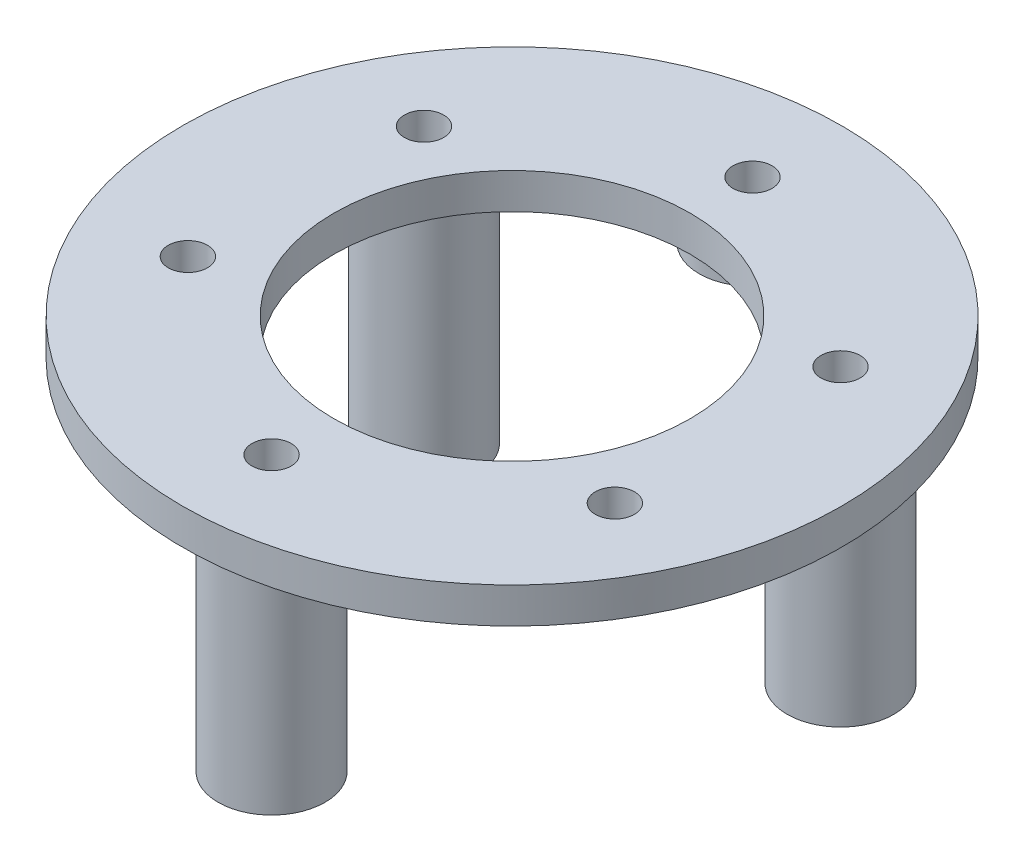
ISO-10303-21;
HEADER;
FILE_DESCRIPTION(('STEP AP214'),'2;1');
FILE_NAME('part.step','',(''),(''),'','','');
FILE_SCHEMA(('AUTOMOTIVE_DESIGN { 1 0 10303 214 1 1 1 1 }'));
ENDSEC;
DATA;
#1=APPLICATION_CONTEXT('core data for automotive mechanical design processes');
#2=APPLICATION_PROTOCOL_DEFINITION('international standard','automotive_design',2000,#1);
#3=PRODUCT_CONTEXT('',#1,'mechanical');
#4=PRODUCT('Part','Part','',(#3));
#5=PRODUCT_RELATED_PRODUCT_CATEGORY('part','',(#4));
#6=PRODUCT_DEFINITION_FORMATION('','',#4);
#7=PRODUCT_DEFINITION_CONTEXT('part definition',#1,'design');
#8=PRODUCT_DEFINITION('design','',#6,#7);
#9=PRODUCT_DEFINITION_SHAPE('','',#8);
#10=(LENGTH_UNIT() NAMED_UNIT(*) SI_UNIT(.MILLI.,.METRE.));
#11=(NAMED_UNIT(*) PLANE_ANGLE_UNIT() SI_UNIT($,.RADIAN.));
#12=(NAMED_UNIT(*) SI_UNIT($,.STERADIAN.) SOLID_ANGLE_UNIT());
#13=UNCERTAINTY_MEASURE_WITH_UNIT(LENGTH_MEASURE(1.E-05),#10,'distance_accuracy_value','');
#14=(GEOMETRIC_REPRESENTATION_CONTEXT(3) GLOBAL_UNCERTAINTY_ASSIGNED_CONTEXT((#13)) GLOBAL_UNIT_ASSIGNED_CONTEXT((#10,
#11,#12)) REPRESENTATION_CONTEXT('',''));
#15=CARTESIAN_POINT('',(0.,0.,0.));
#16=DIRECTION('',(0.,0.,1.));
#17=DIRECTION('',(1.,0.,0.));
#18=AXIS2_PLACEMENT_3D('',#15,#16,#17);
#19=CARTESIAN_POINT('',(0.,0.,0.));
#20=DIRECTION('',(0.,1.,0.));
#21=DIRECTION('',(0.,0.,1.));
#22=AXIS2_PLACEMENT_3D('',#19,#20,#21);
#23=PLANE('',#22);
#24=CARTESIAN_POINT('',(0.,0.,13.5));
#25=DIRECTION('',(0.,1.,0.));
#26=DIRECTION('',(0.,0.,1.));
#27=AXIS2_PLACEMENT_3D('',#24,#25,#26);
#28=CIRCLE('',#27,3.);
#29=CARTESIAN_POINT('',(0.,0.,16.5));
#30=VERTEX_POINT('',#29);
#31=EDGE_CURVE('E177',#30,#30,#28,.F.);
#32=ORIENTED_EDGE('',*,*,#31,.F.);
#33=EDGE_LOOP('',(#32));
#34=FACE_BOUND('',#33,.T.);
#35=CARTESIAN_POINT('',(0.,0.,0.));
#36=DIRECTION('',(0.,1.,0.));
#37=DIRECTION('',(0.,0.,1.));
#38=AXIS2_PLACEMENT_3D('',#35,#36,#37);
#39=CIRCLE('',#38,10.);
#40=CARTESIAN_POINT('',(0.,0.,10.));
#41=VERTEX_POINT('',#40);
#42=EDGE_CURVE('E162',#41,#41,#39,.T.);
#43=ORIENTED_EDGE('',*,*,#42,.T.);
#44=EDGE_LOOP('',(#43));
#45=FACE_BOUND('',#44,.T.);
#46=DIRECTION('',(-0.866025403784438,0.,0.5));
#47=VECTOR('',#46,1.);
#48=CARTESIAN_POINT('',(-6.38397459621556,0.,-13.0573683548744));
#49=LINE('',#48,#47);
#50=CARTESIAN_POINT('',(-6.38397459621556,0.,-13.0573683548744));
#51=VERTEX_POINT('',#50);
#52=CARTESIAN_POINT('',(-8.11602540378444,0.,-12.0573683548744));
#53=VERTEX_POINT('',#52);
#54=EDGE_CURVE('E79',#51,#53,#49,.T.);
#55=ORIENTED_EDGE('',*,*,#54,.F.);
#56=DIRECTION('',(0.5,0.,0.866025403784439));
#57=VECTOR('',#56,1.);
#58=CARTESIAN_POINT('',(-8.38397459621556,0.,-16.5214699700121));
#59=LINE('',#58,#57);
#60=CARTESIAN_POINT('',(-8.37045119717114,0.,-16.4980467557762));
#61=VERTEX_POINT('',#60);
#62=EDGE_CURVE('E90',#61,#51,#59,.T.);
#63=ORIENTED_EDGE('',*,*,#62,.F.);
#64=CARTESIAN_POINT('',(0.,0.,0.));
#65=DIRECTION('',(0.,1.,0.));
#66=DIRECTION('',(0.,0.,1.));
#67=AXIS2_PLACEMENT_3D('',#64,#65,#66);
#68=CIRCLE('',#67,18.5);
#69=CARTESIAN_POINT('',(-10.10250200474,0.,-15.4980467557762));
#70=VERTEX_POINT('',#69);
#71=EDGE_CURVE('E166',#70,#61,#68,.T.);
#72=ORIENTED_EDGE('',*,*,#71,.F.);
#73=DIRECTION('',(-0.5,0.,-0.866025403784438));
#74=VECTOR('',#73,1.);
#75=CARTESIAN_POINT('',(-10.1160254037844,0.,-15.5214699700121));
#76=LINE('',#75,#74);
#77=EDGE_CURVE('E92',#53,#70,#76,.T.);
#78=ORIENTED_EDGE('',*,*,#77,.F.);
#79=EDGE_LOOP('',(#55,#63,#72,#78));
#80=FACE_BOUND('',#79,.T.);
#81=CARTESIAN_POINT('',(0.,0.,-13.5));
#82=DIRECTION('',(0.,1.,0.));
#83=DIRECTION('',(0.,0.,1.));
#84=AXIS2_PLACEMENT_3D('',#81,#82,#83);
#85=CIRCLE('',#84,3.);
#86=CARTESIAN_POINT('',(0.,0.,-10.5));
#87=VERTEX_POINT('',#86);
#88=EDGE_CURVE('E147',#87,#87,#85,.T.);
#89=ORIENTED_EDGE('',*,*,#88,.T.);
#90=EDGE_LOOP('',(#89));
#91=FACE_BOUND('',#90,.T.);
#92=CARTESIAN_POINT('',(-11.9855076993414,0.,6.21269709458206));
#93=DIRECTION('',(0.,1.,0.));
#94=DIRECTION('',(0.,0.,1.));
#95=AXIS2_PLACEMENT_3D('',#92,#93,#94);
#96=CIRCLE('',#95,3.);
#97=CARTESIAN_POINT('',(-11.9855076993414,0.,9.21269709458206));
#98=VERTEX_POINT('',#97);
#99=EDGE_CURVE('E138',#98,#98,#96,.T.);
#100=ORIENTED_EDGE('',*,*,#99,.T.);
#101=EDGE_LOOP('',(#100));
#102=FACE_BOUND('',#101,.T.);
#103=CARTESIAN_POINT('',(11.9855076993414,0.,6.21269709458206));
#104=DIRECTION('',(0.,1.,0.));
#105=DIRECTION('',(0.,0.,1.));
#106=AXIS2_PLACEMENT_3D('',#103,#104,#105);
#107=CIRCLE('',#106,3.);
#108=CARTESIAN_POINT('',(11.9855076993414,0.,9.21269709458206));
#109=VERTEX_POINT('',#108);
#110=EDGE_CURVE('E129',#109,#109,#107,.T.);
#111=ORIENTED_EDGE('',*,*,#110,.T.);
#112=EDGE_LOOP('',(#111));
#113=FACE_BOUND('',#112,.T.);
#114=CARTESIAN_POINT('',(-11.6913429510899,0.,-6.75000000000005));
#115=DIRECTION('',(0.,1.,0.));
#116=DIRECTION('',(0.,0.,1.));
#117=AXIS2_PLACEMENT_3D('',#114,#115,#116);
#118=CIRCLE('',#117,3.);
#119=CARTESIAN_POINT('',(-11.6913429510899,0.,-3.75000000000005));
#120=VERTEX_POINT('',#119);
#121=EDGE_CURVE('E172',#120,#120,#118,.F.);
#122=ORIENTED_EDGE('',*,*,#121,.F.);
#123=EDGE_LOOP('',(#122));
#124=FACE_BOUND('',#123,.T.);
#125=CARTESIAN_POINT('',(11.6913429510899,0.,-6.75000000000006));
#126=DIRECTION('',(0.,1.,0.));
#127=DIRECTION('',(0.,0.,1.));
#128=AXIS2_PLACEMENT_3D('',#125,#126,#127);
#129=CIRCLE('',#128,3.);
#130=CARTESIAN_POINT('',(11.6913429510899,0.,-3.75000000000006));
#131=VERTEX_POINT('',#130);
#132=EDGE_CURVE('E180',#131,#131,#129,.F.);
#133=ORIENTED_EDGE('',*,*,#132,.F.);
#134=EDGE_LOOP('',(#133));
#135=FACE_BOUND('',#134,.T.);
#136=ADVANCED_FACE('F33',(#34,#45,#80,#91,#102,#113,#124,#135),#23,.F.);
#137=CARTESIAN_POINT('',(0.,2.,0.));
#138=DIRECTION('',(0.,1.,0.));
#139=DIRECTION('',(0.,0.,1.));
#140=AXIS2_PLACEMENT_3D('',#137,#138,#139);
#141=PLANE('',#140);
#142=CARTESIAN_POINT('',(-11.6913429510899,2.,-6.75000000000005));
#143=DIRECTION('',(0.,1.,0.));
#144=DIRECTION('',(0.,0.,1.));
#145=AXIS2_PLACEMENT_3D('',#142,#143,#144);
#146=CIRCLE('',#145,1.10000000000001);
#147=CARTESIAN_POINT('',(-11.6913429510899,2.,-5.65000000000004));
#148=VERTEX_POINT('',#147);
#149=EDGE_CURVE('E118',#148,#148,#146,.T.);
#150=ORIENTED_EDGE('',*,*,#149,.F.);
#151=EDGE_LOOP('',(#150));
#152=FACE_BOUND('',#151,.T.);
#153=CARTESIAN_POINT('',(11.6913429510899,2.,-6.75000000000006));
#154=DIRECTION('',(0.,1.,0.));
#155=DIRECTION('',(0.,0.,1.));
#156=AXIS2_PLACEMENT_3D('',#153,#154,#155);
#157=CIRCLE('',#156,1.1);
#158=CARTESIAN_POINT('',(11.6913429510899,2.,-5.65000000000006));
#159=VERTEX_POINT('',#158);
#160=EDGE_CURVE('E122',#159,#159,#157,.T.);
#161=ORIENTED_EDGE('',*,*,#160,.F.);
#162=EDGE_LOOP('',(#161));
#163=FACE_BOUND('',#162,.T.);
#164=CARTESIAN_POINT('',(0.,2.,13.5));
#165=DIRECTION('',(0.,1.,0.));
#166=DIRECTION('',(0.,0.,1.));
#167=AXIS2_PLACEMENT_3D('',#164,#165,#166);
#168=CIRCLE('',#167,1.1);
#169=CARTESIAN_POINT('',(0.,2.,14.6));
#170=VERTEX_POINT('',#169);
#171=EDGE_CURVE('E117',#170,#170,#168,.T.);
#172=ORIENTED_EDGE('',*,*,#171,.F.);
#173=EDGE_LOOP('',(#172));
#174=FACE_BOUND('',#173,.T.);
#175=CARTESIAN_POINT('',(11.9855076993414,2.,6.21269709458206));
#176=DIRECTION('',(0.,1.,0.));
#177=DIRECTION('',(0.,0.,1.));
#178=AXIS2_PLACEMENT_3D('',#175,#176,#177);
#179=CIRCLE('',#178,1.1);
#180=CARTESIAN_POINT('',(11.9855076993414,2.,7.31269709458206));
#181=VERTEX_POINT('',#180);
#182=EDGE_CURVE('E156',#181,#181,#179,.T.);
#183=ORIENTED_EDGE('',*,*,#182,.F.);
#184=EDGE_LOOP('',(#183));
#185=FACE_BOUND('',#184,.T.);
#186=CARTESIAN_POINT('',(0.,2.,0.));
#187=DIRECTION('',(0.,1.,0.));
#188=DIRECTION('',(0.,0.,1.));
#189=AXIS2_PLACEMENT_3D('',#186,#187,#188);
#190=CIRCLE('',#189,10.);
#191=CARTESIAN_POINT('',(0.,2.,10.));
#192=VERTEX_POINT('',#191);
#193=EDGE_CURVE('E163',#192,#192,#190,.T.);
#194=ORIENTED_EDGE('',*,*,#193,.F.);
#195=EDGE_LOOP('',(#194));
#196=FACE_BOUND('',#195,.T.);
#197=CARTESIAN_POINT('',(0.,2.,0.));
#198=DIRECTION('',(0.,1.,0.));
#199=DIRECTION('',(0.,0.,1.));
#200=AXIS2_PLACEMENT_3D('',#197,#198,#199);
#201=CIRCLE('',#200,18.5);
#202=CARTESIAN_POINT('',(0.,2.,18.5));
#203=VERTEX_POINT('',#202);
#204=EDGE_CURVE('E169',#203,#203,#201,.T.);
#205=ORIENTED_EDGE('',*,*,#204,.T.);
#206=EDGE_LOOP('',(#205));
#207=FACE_BOUND('',#206,.T.);
#208=CARTESIAN_POINT('',(0.,2.,-13.5));
#209=DIRECTION('',(0.,1.,0.));
#210=DIRECTION('',(0.,0.,1.));
#211=AXIS2_PLACEMENT_3D('',#208,#209,#210);
#212=CIRCLE('',#211,1.1);
#213=CARTESIAN_POINT('',(0.,2.,-12.4));
#214=VERTEX_POINT('',#213);
#215=EDGE_CURVE('E159',#214,#214,#212,.T.);
#216=ORIENTED_EDGE('',*,*,#215,.F.);
#217=EDGE_LOOP('',(#216));
#218=FACE_BOUND('',#217,.T.);
#219=CARTESIAN_POINT('',(-11.9855076993414,2.,6.21269709458206));
#220=DIRECTION('',(0.,1.,0.));
#221=DIRECTION('',(0.,0.,1.));
#222=AXIS2_PLACEMENT_3D('',#219,#220,#221);
#223=CIRCLE('',#222,1.1);
#224=CARTESIAN_POINT('',(-11.9855076993414,2.,7.31269709458206));
#225=VERTEX_POINT('',#224);
#226=EDGE_CURVE('E151',#225,#225,#223,.T.);
#227=ORIENTED_EDGE('',*,*,#226,.F.);
#228=EDGE_LOOP('',(#227));
#229=FACE_BOUND('',#228,.T.);
#230=ADVANCED_FACE('F204',(#152,#163,#174,#185,#196,#207,#218,#229),#141,.T.);
#231=CARTESIAN_POINT('',(0.,2.,0.));
#232=DIRECTION('',(0.,-1.,0.));
#233=DIRECTION('',(0.,0.,-1.));
#234=AXIS2_PLACEMENT_3D('',#231,#232,#233);
#235=CYLINDRICAL_SURFACE('',#234,18.5);
#236=ORIENTED_EDGE('',*,*,#71,.T.);
#237=DIRECTION('',(0.,-1.,0.));
#238=VECTOR('',#237,1.);
#239=CARTESIAN_POINT('',(-8.37045119717114,2.,-16.4980467557762));
#240=LINE('',#239,#238);
#241=CARTESIAN_POINT('',(-8.37045119717114,0.44,-16.4980467557762));
#242=VERTEX_POINT('',#241);
#243=EDGE_CURVE('E11',#61,#242,#240,.F.);
#244=ORIENTED_EDGE('',*,*,#243,.T.);
#245=CARTESIAN_POINT('',(0.,0.44,0.));
#246=DIRECTION('',(0.,1.,0.));
#247=DIRECTION('',(0.,0.,1.));
#248=AXIS2_PLACEMENT_3D('',#245,#246,#247);
#249=CIRCLE('',#248,18.5);
#250=CARTESIAN_POINT('',(-10.10250200474,0.44,-15.4980467557762));
#251=VERTEX_POINT('',#250);
#252=EDGE_CURVE('E53',#242,#251,#249,.T.);
#253=ORIENTED_EDGE('',*,*,#252,.T.);
#254=DIRECTION('',(0.,-1.,0.));
#255=VECTOR('',#254,1.);
#256=CARTESIAN_POINT('',(-10.10250200474,2.,-15.4980467557762));
#257=LINE('',#256,#255);
#258=EDGE_CURVE('E41',#251,#70,#257,.T.);
#259=ORIENTED_EDGE('',*,*,#258,.T.);
#260=EDGE_LOOP('',(#236,#244,#253,#259));
#261=FACE_BOUND('',#260,.T.);
#262=ORIENTED_EDGE('',*,*,#204,.F.);
#263=EDGE_LOOP('',(#262));
#264=FACE_BOUND('',#263,.T.);
#265=ADVANCED_FACE('F35',(#261,#264),#235,.T.);
#266=CARTESIAN_POINT('',(0.,2.,0.));
#267=DIRECTION('',(0.,-1.,0.));
#268=DIRECTION('',(0.,0.,-1.));
#269=AXIS2_PLACEMENT_3D('',#266,#267,#268);
#270=CYLINDRICAL_SURFACE('',#269,10.);
#271=ORIENTED_EDGE('',*,*,#193,.T.);
#272=EDGE_LOOP('',(#271));
#273=FACE_BOUND('',#272,.T.);
#274=ORIENTED_EDGE('',*,*,#42,.F.);
#275=EDGE_LOOP('',(#274));
#276=FACE_BOUND('',#275,.T.);
#277=ADVANCED_FACE('F214',(#273,#276),#270,.F.);
#278=CARTESIAN_POINT('',(0.,2.,-13.5));
#279=DIRECTION('',(0.,-1.,0.));
#280=DIRECTION('',(0.,0.,-1.));
#281=AXIS2_PLACEMENT_3D('',#278,#279,#280);
#282=CYLINDRICAL_SURFACE('',#281,1.1);
#283=ORIENTED_EDGE('',*,*,#215,.T.);
#284=EDGE_LOOP('',(#283));
#285=FACE_BOUND('',#284,.T.);
#286=CARTESIAN_POINT('',(0.,-1.2,-13.5));
#287=DIRECTION('',(0.,1.,0.));
#288=DIRECTION('',(0.,0.,1.));
#289=AXIS2_PLACEMENT_3D('',#286,#287,#288);
#290=CIRCLE('',#289,1.1);
#291=CARTESIAN_POINT('',(0.,-1.2,-12.4));
#292=VERTEX_POINT('',#291);
#293=EDGE_CURVE('E142',#292,#292,#290,.T.);
#294=ORIENTED_EDGE('',*,*,#293,.F.);
#295=EDGE_LOOP('',(#294));
#296=FACE_BOUND('',#295,.T.);
#297=ADVANCED_FACE('F217',(#285,#296),#282,.F.);
#298=CARTESIAN_POINT('',(11.9855076993414,2.,6.21269709458206));
#299=DIRECTION('',(0.,-1.,0.));
#300=DIRECTION('',(0.,0.,-1.));
#301=AXIS2_PLACEMENT_3D('',#298,#299,#300);
#302=CYLINDRICAL_SURFACE('',#301,1.1);
#303=ORIENTED_EDGE('',*,*,#182,.T.);
#304=EDGE_LOOP('',(#303));
#305=FACE_BOUND('',#304,.T.);
#306=CARTESIAN_POINT('',(11.9855076993414,-1.2,6.21269709458206));
#307=DIRECTION('',(0.,1.,0.));
#308=DIRECTION('',(0.,0.,1.));
#309=AXIS2_PLACEMENT_3D('',#306,#307,#308);
#310=CIRCLE('',#309,1.1);
#311=CARTESIAN_POINT('',(11.9855076993414,-1.2,7.31269709458206));
#312=VERTEX_POINT('',#311);
#313=EDGE_CURVE('E121',#312,#312,#310,.T.);
#314=ORIENTED_EDGE('',*,*,#313,.F.);
#315=EDGE_LOOP('',(#314));
#316=FACE_BOUND('',#315,.T.);
#317=ADVANCED_FACE('F221',(#305,#316),#302,.F.);
#318=CARTESIAN_POINT('',(-11.9855076993414,2.,6.21269709458206));
#319=DIRECTION('',(0.,-1.,0.));
#320=DIRECTION('',(0.,0.,-1.));
#321=AXIS2_PLACEMENT_3D('',#318,#319,#320);
#322=CYLINDRICAL_SURFACE('',#321,1.1);
#323=ORIENTED_EDGE('',*,*,#226,.T.);
#324=EDGE_LOOP('',(#323));
#325=FACE_BOUND('',#324,.T.);
#326=CARTESIAN_POINT('',(-11.9855076993414,-1.2,6.21269709458206));
#327=DIRECTION('',(0.,1.,0.));
#328=DIRECTION('',(0.,0.,1.));
#329=AXIS2_PLACEMENT_3D('',#326,#327,#328);
#330=CIRCLE('',#329,1.1);
#331=CARTESIAN_POINT('',(-11.9855076993414,-1.2,7.31269709458206));
#332=VERTEX_POINT('',#331);
#333=EDGE_CURVE('E133',#332,#332,#330,.T.);
#334=ORIENTED_EDGE('',*,*,#333,.F.);
#335=EDGE_LOOP('',(#334));
#336=FACE_BOUND('',#335,.T.);
#337=ADVANCED_FACE('F225',(#325,#336),#322,.F.);
#338=CARTESIAN_POINT('',(0.,-1.2,-13.5));
#339=DIRECTION('',(0.,1.,0.));
#340=DIRECTION('',(0.,0.,1.));
#341=AXIS2_PLACEMENT_3D('',#338,#339,#340);
#342=CYLINDRICAL_SURFACE('',#341,3.);
#343=CARTESIAN_POINT('',(0.,-1.2,-13.5));
#344=DIRECTION('',(0.,1.,0.));
#345=DIRECTION('',(0.,0.,1.));
#346=AXIS2_PLACEMENT_3D('',#343,#344,#345);
#347=CIRCLE('',#346,3.);
#348=CARTESIAN_POINT('',(0.,-1.2,-10.5));
#349=VERTEX_POINT('',#348);
#350=EDGE_CURVE('E148',#349,#349,#347,.T.);
#351=ORIENTED_EDGE('',*,*,#350,.T.);
#352=EDGE_LOOP('',(#351));
#353=FACE_BOUND('',#352,.T.);
#354=ORIENTED_EDGE('',*,*,#88,.F.);
#355=EDGE_LOOP('',(#354));
#356=FACE_BOUND('',#355,.T.);
#357=ADVANCED_FACE('F229',(#353,#356),#342,.T.);
#358=CARTESIAN_POINT('',(0.,-1.2,-13.5));
#359=DIRECTION('',(0.,1.,0.));
#360=DIRECTION('',(0.,0.,1.));
#361=AXIS2_PLACEMENT_3D('',#358,#359,#360);
#362=PLANE('',#361);
#363=ORIENTED_EDGE('',*,*,#293,.T.);
#364=EDGE_LOOP('',(#363));
#365=FACE_BOUND('',#364,.T.);
#366=ORIENTED_EDGE('',*,*,#350,.F.);
#367=EDGE_LOOP('',(#366));
#368=FACE_BOUND('',#367,.T.);
#369=ADVANCED_FACE('F233',(#365,#368),#362,.F.);
#370=CARTESIAN_POINT('',(-11.9855076993414,-1.2,6.21269709458206));
#371=DIRECTION('',(0.,1.,0.));
#372=DIRECTION('',(0.,0.,1.));
#373=AXIS2_PLACEMENT_3D('',#370,#371,#372);
#374=CYLINDRICAL_SURFACE('',#373,3.);
#375=CARTESIAN_POINT('',(-11.9855076993414,-1.2,6.21269709458206));
#376=DIRECTION('',(0.,1.,0.));
#377=DIRECTION('',(0.,0.,1.));
#378=AXIS2_PLACEMENT_3D('',#375,#376,#377);
#379=CIRCLE('',#378,3.);
#380=CARTESIAN_POINT('',(-11.9855076993414,-1.2,9.21269709458206));
#381=VERTEX_POINT('',#380);
#382=EDGE_CURVE('E139',#381,#381,#379,.T.);
#383=ORIENTED_EDGE('',*,*,#382,.T.);
#384=EDGE_LOOP('',(#383));
#385=FACE_BOUND('',#384,.T.);
#386=ORIENTED_EDGE('',*,*,#99,.F.);
#387=EDGE_LOOP('',(#386));
#388=FACE_BOUND('',#387,.T.);
#389=ADVANCED_FACE('F237',(#385,#388),#374,.T.);
#390=CARTESIAN_POINT('',(-11.9855076993414,-1.2,6.21269709458206));
#391=DIRECTION('',(0.,1.,0.));
#392=DIRECTION('',(0.,0.,1.));
#393=AXIS2_PLACEMENT_3D('',#390,#391,#392);
#394=PLANE('',#393);
#395=ORIENTED_EDGE('',*,*,#333,.T.);
#396=EDGE_LOOP('',(#395));
#397=FACE_BOUND('',#396,.T.);
#398=ORIENTED_EDGE('',*,*,#382,.F.);
#399=EDGE_LOOP('',(#398));
#400=FACE_BOUND('',#399,.T.);
#401=ADVANCED_FACE('F241',(#397,#400),#394,.F.);
#402=CARTESIAN_POINT('',(11.9855076993414,-1.2,6.21269709458206));
#403=DIRECTION('',(0.,1.,0.));
#404=DIRECTION('',(0.,0.,1.));
#405=AXIS2_PLACEMENT_3D('',#402,#403,#404);
#406=CYLINDRICAL_SURFACE('',#405,3.);
#407=CARTESIAN_POINT('',(11.9855076993414,-1.2,6.21269709458206));
#408=DIRECTION('',(0.,1.,0.));
#409=DIRECTION('',(0.,0.,1.));
#410=AXIS2_PLACEMENT_3D('',#407,#408,#409);
#411=CIRCLE('',#410,3.);
#412=CARTESIAN_POINT('',(11.9855076993414,-1.2,9.21269709458206));
#413=VERTEX_POINT('',#412);
#414=EDGE_CURVE('E130',#413,#413,#411,.T.);
#415=ORIENTED_EDGE('',*,*,#414,.T.);
#416=EDGE_LOOP('',(#415));
#417=FACE_BOUND('',#416,.T.);
#418=ORIENTED_EDGE('',*,*,#110,.F.);
#419=EDGE_LOOP('',(#418));
#420=FACE_BOUND('',#419,.T.);
#421=ADVANCED_FACE('F245',(#417,#420),#406,.T.);
#422=CARTESIAN_POINT('',(11.9855076993414,-1.2,6.21269709458206));
#423=DIRECTION('',(0.,1.,0.));
#424=DIRECTION('',(0.,0.,1.));
#425=AXIS2_PLACEMENT_3D('',#422,#423,#424);
#426=PLANE('',#425);
#427=ORIENTED_EDGE('',*,*,#313,.T.);
#428=EDGE_LOOP('',(#427));
#429=FACE_BOUND('',#428,.T.);
#430=ORIENTED_EDGE('',*,*,#414,.F.);
#431=EDGE_LOOP('',(#430));
#432=FACE_BOUND('',#431,.T.);
#433=ADVANCED_FACE('F249',(#429,#432),#426,.F.);
#434=CARTESIAN_POINT('',(0.,-1.2,13.5));
#435=DIRECTION('',(0.,1.,0.));
#436=DIRECTION('',(0.,0.,1.));
#437=AXIS2_PLACEMENT_3D('',#434,#435,#436);
#438=CYLINDRICAL_SURFACE('',#437,1.1);
#439=CARTESIAN_POINT('',(0.,-13.4,13.5));
#440=DIRECTION('',(0.,-1.,0.));
#441=DIRECTION('',(0.,0.,-1.));
#442=AXIS2_PLACEMENT_3D('',#439,#440,#441);
#443=CIRCLE('',#442,1.1);
#444=CARTESIAN_POINT('',(0.,-13.4,14.6));
#445=VERTEX_POINT('',#444);
#446=EDGE_CURVE('E105',#445,#445,#443,.T.);
#447=CARTESIAN_POINT('',(0.,2.,14.6));
#448=CARTESIAN_POINT('',(0.,1.83958333333333,14.6));
#449=CARTESIAN_POINT('',(0.,1.67916666666667,14.6));
#450=CARTESIAN_POINT('',(0.,1.35833333333333,14.6));
#451=CARTESIAN_POINT('',(0.,1.19791666666667,14.6));
#452=CARTESIAN_POINT('',(0.,0.877083333333333,14.6));
#453=CARTESIAN_POINT('',(0.,0.716666666666666,14.6));
#454=CARTESIAN_POINT('',(0.,0.395833333333333,14.6));
#455=CARTESIAN_POINT('',(0.,0.235416666666666,14.6));
#456=CARTESIAN_POINT('',(0.,-0.0854166666666672,14.6));
#457=CARTESIAN_POINT('',(0.,-0.245833333333334,14.6));
#458=CARTESIAN_POINT('',(0.,-0.566666666666667,14.6));
#459=CARTESIAN_POINT('',(0.,-0.727083333333334,14.6));
#460=CARTESIAN_POINT('',(0.,-1.04791666666667,14.6));
#461=CARTESIAN_POINT('',(0.,-1.20833333333333,14.6));
#462=CARTESIAN_POINT('',(0.,-1.52916666666667,14.6));
#463=CARTESIAN_POINT('',(0.,-1.68958333333333,14.6));
#464=CARTESIAN_POINT('',(0.,-2.01041666666667,14.6));
#465=CARTESIAN_POINT('',(0.,-2.17083333333333,14.6));
#466=CARTESIAN_POINT('',(0.,-2.49166666666667,14.6));
#467=CARTESIAN_POINT('',(0.,-2.65208333333333,14.6));
#468=CARTESIAN_POINT('',(0.,-2.97291666666667,14.6));
#469=CARTESIAN_POINT('',(0.,-3.13333333333333,14.6));
#470=CARTESIAN_POINT('',(0.,-3.45416666666667,14.6));
#471=CARTESIAN_POINT('',(0.,-3.61458333333333,14.6));
#472=CARTESIAN_POINT('',(0.,-3.93541666666667,14.6));
#473=CARTESIAN_POINT('',(0.,-4.09583333333333,14.6));
#474=CARTESIAN_POINT('',(0.,-4.41666666666667,14.6));
#475=CARTESIAN_POINT('',(0.,-4.57708333333333,14.6));
#476=CARTESIAN_POINT('',(0.,-4.89791666666667,14.6));
#477=CARTESIAN_POINT('',(0.,-5.05833333333333,14.6));
#478=CARTESIAN_POINT('',(0.,-5.37916666666667,14.6));
#479=CARTESIAN_POINT('',(0.,-5.53958333333333,14.6));
#480=CARTESIAN_POINT('',(0.,-5.86041666666667,14.6));
#481=CARTESIAN_POINT('',(0.,-6.02083333333333,14.6));
#482=CARTESIAN_POINT('',(0.,-6.34166666666667,14.6));
#483=CARTESIAN_POINT('',(0.,-6.50208333333333,14.6));
#484=CARTESIAN_POINT('',(0.,-6.82291666666667,14.6));
#485=CARTESIAN_POINT('',(0.,-6.98333333333333,14.6));
#486=CARTESIAN_POINT('',(0.,-7.30416666666667,14.6));
#487=CARTESIAN_POINT('',(0.,-7.46458333333333,14.6));
#488=CARTESIAN_POINT('',(0.,-7.78541666666667,14.6));
#489=CARTESIAN_POINT('',(0.,-7.94583333333333,14.6));
#490=CARTESIAN_POINT('',(0.,-8.26666666666667,14.6));
#491=CARTESIAN_POINT('',(0.,-8.42708333333333,14.6));
#492=CARTESIAN_POINT('',(0.,-8.74791666666667,14.6));
#493=CARTESIAN_POINT('',(0.,-8.90833333333333,14.6));
#494=CARTESIAN_POINT('',(0.,-9.22916666666667,14.6));
#495=CARTESIAN_POINT('',(0.,-9.38958333333333,14.6));
#496=CARTESIAN_POINT('',(0.,-9.71041666666667,14.6));
#497=CARTESIAN_POINT('',(0.,-9.87083333333333,14.6));
#498=CARTESIAN_POINT('',(0.,-10.1916666666667,14.6));
#499=CARTESIAN_POINT('',(0.,-10.3520833333333,14.6));
#500=CARTESIAN_POINT('',(0.,-10.6729166666667,14.6));
#501=CARTESIAN_POINT('',(0.,-10.8333333333333,14.6));
#502=CARTESIAN_POINT('',(0.,-11.1541666666667,14.6));
#503=CARTESIAN_POINT('',(0.,-11.3145833333333,14.6));
#504=CARTESIAN_POINT('',(0.,-11.6354166666667,14.6));
#505=CARTESIAN_POINT('',(0.,-11.7958333333333,14.6));
#506=CARTESIAN_POINT('',(0.,-12.1166666666667,14.6));
#507=CARTESIAN_POINT('',(0.,-12.2770833333333,14.6));
#508=CARTESIAN_POINT('',(0.,-12.5979166666667,14.6));
#509=CARTESIAN_POINT('',(0.,-12.7583333333333,14.6));
#510=CARTESIAN_POINT('',(0.,-13.0791666666667,14.6));
#511=CARTESIAN_POINT('',(0.,-13.2395833333333,14.6));
#512=CARTESIAN_POINT('',(0.,-13.4,14.6));
#513=B_SPLINE_CURVE_WITH_KNOTS('',3,(#447,#448,#449,#450,#451,#452,#453,#454,#455,#456,#457,
#458,#459,#460,#461,#462,#463,#464,#465,#466,#467,#468,#469,#470,#471,#472,#473,#474,#475,#476,
#477,#478,#479,#480,#481,#482,#483,#484,#485,#486,#487,#488,#489,#490,#491,#492,#493,#494,#495,
#496,#497,#498,#499,#500,#501,#502,#503,#504,#505,#506,#507,#508,#509,#510,#511,#512),
.UNSPECIFIED.,.F.,.F.,(4,2,2,2,2,2,2,2,2,2,2,2,2,2,2,2,2,2,2,2,2,2,2,2,2,2,2,2,2,2,2,2,4),(0.,
0.48125,0.9625,1.44375,1.925,2.40625,2.8875,3.36875,3.85,4.33125,4.8125,5.29375,5.775,6.25625,
6.7375,7.21875,7.7,8.18125,8.6625,9.14375,9.625,10.10625,10.5875,11.06875,11.55,12.03125,
12.5125,12.99375,13.475,13.95625,14.4375,14.91875,15.4),.UNSPECIFIED.);
#514=EDGE_CURVE('BSEAM253',#170,#445,#513,.T.);
#515=ORIENTED_EDGE('',*,*,#171,.T.);
#516=ORIENTED_EDGE('',*,*,#446,.T.);
#517=ORIENTED_EDGE('',*,*,#514,.T.);
#518=ORIENTED_EDGE('',*,*,#514,.F.);
#519=EDGE_LOOP('',(#515,#517,#516,#518));
#520=FACE_BOUND('',#519,.T.);
#521=ADVANCED_FACE('F253',(#520),#438,.F.);
#522=CARTESIAN_POINT('',(11.6913429510899,-1.2,-6.75000000000006));
#523=DIRECTION('',(0.,1.,0.));
#524=DIRECTION('',(0.,0.,1.));
#525=AXIS2_PLACEMENT_3D('',#522,#523,#524);
#526=CYLINDRICAL_SURFACE('',#525,1.1);
#527=CARTESIAN_POINT('',(11.6913429510899,-13.4,-6.75000000000006));
#528=DIRECTION('',(0.,-1.,0.));
#529=DIRECTION('',(0.,0.,-1.));
#530=AXIS2_PLACEMENT_3D('',#527,#528,#529);
#531=CIRCLE('',#530,1.1);
#532=CARTESIAN_POINT('',(11.6913429510899,-13.4,-5.65000000000006));
#533=VERTEX_POINT('',#532);
#534=EDGE_CURVE('E98',#533,#533,#531,.T.);
#535=CARTESIAN_POINT('',(11.6913429510899,2.,-5.65000000000006));
#536=CARTESIAN_POINT('',(11.6913429510899,1.83958333333333,-5.65000000000006));
#537=CARTESIAN_POINT('',(11.6913429510899,1.67916666666667,-5.65000000000006));
#538=CARTESIAN_POINT('',(11.6913429510899,1.35833333333333,-5.65000000000006));
#539=CARTESIAN_POINT('',(11.6913429510899,1.19791666666667,-5.65000000000006));
#540=CARTESIAN_POINT('',(11.6913429510899,0.877083333333333,-5.65000000000006));
#541=CARTESIAN_POINT('',(11.6913429510899,0.716666666666666,-5.65000000000006));
#542=CARTESIAN_POINT('',(11.6913429510899,0.395833333333333,-5.65000000000006));
#543=CARTESIAN_POINT('',(11.6913429510899,0.235416666666666,-5.65000000000006));
#544=CARTESIAN_POINT('',(11.6913429510899,-0.0854166666666672,-5.65000000000006));
#545=CARTESIAN_POINT('',(11.6913429510899,-0.245833333333334,-5.65000000000006));
#546=CARTESIAN_POINT('',(11.6913429510899,-0.566666666666667,-5.65000000000006));
#547=CARTESIAN_POINT('',(11.6913429510899,-0.727083333333334,-5.65000000000006));
#548=CARTESIAN_POINT('',(11.6913429510899,-1.04791666666667,-5.65000000000006));
#549=CARTESIAN_POINT('',(11.6913429510899,-1.20833333333333,-5.65000000000006));
#550=CARTESIAN_POINT('',(11.6913429510899,-1.52916666666667,-5.65000000000006));
#551=CARTESIAN_POINT('',(11.6913429510899,-1.68958333333333,-5.65000000000006));
#552=CARTESIAN_POINT('',(11.6913429510899,-2.01041666666667,-5.65000000000006));
#553=CARTESIAN_POINT('',(11.6913429510899,-2.17083333333333,-5.65000000000006));
#554=CARTESIAN_POINT('',(11.6913429510899,-2.49166666666667,-5.65000000000006));
#555=CARTESIAN_POINT('',(11.6913429510899,-2.65208333333333,-5.65000000000006));
#556=CARTESIAN_POINT('',(11.6913429510899,-2.97291666666667,-5.65000000000006));
#557=CARTESIAN_POINT('',(11.6913429510899,-3.13333333333333,-5.65000000000006));
#558=CARTESIAN_POINT('',(11.6913429510899,-3.45416666666667,-5.65000000000006));
#559=CARTESIAN_POINT('',(11.6913429510899,-3.61458333333333,-5.65000000000006));
#560=CARTESIAN_POINT('',(11.6913429510899,-3.93541666666667,-5.65000000000006));
#561=CARTESIAN_POINT('',(11.6913429510899,-4.09583333333333,-5.65000000000006));
#562=CARTESIAN_POINT('',(11.6913429510899,-4.41666666666667,-5.65000000000006));
#563=CARTESIAN_POINT('',(11.6913429510899,-4.57708333333333,-5.65000000000006));
#564=CARTESIAN_POINT('',(11.6913429510899,-4.89791666666667,-5.65000000000006));
#565=CARTESIAN_POINT('',(11.6913429510899,-5.05833333333333,-5.65000000000006));
#566=CARTESIAN_POINT('',(11.6913429510899,-5.37916666666667,-5.65000000000006));
#567=CARTESIAN_POINT('',(11.6913429510899,-5.53958333333333,-5.65000000000006));
#568=CARTESIAN_POINT('',(11.6913429510899,-5.86041666666667,-5.65000000000006));
#569=CARTESIAN_POINT('',(11.6913429510899,-6.02083333333333,-5.65000000000006));
#570=CARTESIAN_POINT('',(11.6913429510899,-6.34166666666667,-5.65000000000006));
#571=CARTESIAN_POINT('',(11.6913429510899,-6.50208333333333,-5.65000000000006));
#572=CARTESIAN_POINT('',(11.6913429510899,-6.82291666666667,-5.65000000000006));
#573=CARTESIAN_POINT('',(11.6913429510899,-6.98333333333333,-5.65000000000006));
#574=CARTESIAN_POINT('',(11.6913429510899,-7.30416666666667,-5.65000000000006));
#575=CARTESIAN_POINT('',(11.6913429510899,-7.46458333333333,-5.65000000000006));
#576=CARTESIAN_POINT('',(11.6913429510899,-7.78541666666667,-5.65000000000006));
#577=CARTESIAN_POINT('',(11.6913429510899,-7.94583333333333,-5.65000000000006));
#578=CARTESIAN_POINT('',(11.6913429510899,-8.26666666666667,-5.65000000000006));
#579=CARTESIAN_POINT('',(11.6913429510899,-8.42708333333333,-5.65000000000006));
#580=CARTESIAN_POINT('',(11.6913429510899,-8.74791666666667,-5.65000000000006));
#581=CARTESIAN_POINT('',(11.6913429510899,-8.90833333333333,-5.65000000000006));
#582=CARTESIAN_POINT('',(11.6913429510899,-9.22916666666667,-5.65000000000006));
#583=CARTESIAN_POINT('',(11.6913429510899,-9.38958333333333,-5.65000000000006));
#584=CARTESIAN_POINT('',(11.6913429510899,-9.71041666666667,-5.65000000000006));
#585=CARTESIAN_POINT('',(11.6913429510899,-9.87083333333333,-5.65000000000006));
#586=CARTESIAN_POINT('',(11.6913429510899,-10.1916666666667,-5.65000000000006));
#587=CARTESIAN_POINT('',(11.6913429510899,-10.3520833333333,-5.65000000000006));
#588=CARTESIAN_POINT('',(11.6913429510899,-10.6729166666667,-5.65000000000006));
#589=CARTESIAN_POINT('',(11.6913429510899,-10.8333333333333,-5.65000000000006));
#590=CARTESIAN_POINT('',(11.6913429510899,-11.1541666666667,-5.65000000000006));
#591=CARTESIAN_POINT('',(11.6913429510899,-11.3145833333333,-5.65000000000006));
#592=CARTESIAN_POINT('',(11.6913429510899,-11.6354166666667,-5.65000000000006));
#593=CARTESIAN_POINT('',(11.6913429510899,-11.7958333333333,-5.65000000000006));
#594=CARTESIAN_POINT('',(11.6913429510899,-12.1166666666667,-5.65000000000006));
#595=CARTESIAN_POINT('',(11.6913429510899,-12.2770833333333,-5.65000000000006));
#596=CARTESIAN_POINT('',(11.6913429510899,-12.5979166666667,-5.65000000000006));
#597=CARTESIAN_POINT('',(11.6913429510899,-12.7583333333333,-5.65000000000006));
#598=CARTESIAN_POINT('',(11.6913429510899,-13.0791666666667,-5.65000000000006));
#599=CARTESIAN_POINT('',(11.6913429510899,-13.2395833333333,-5.65000000000006));
#600=CARTESIAN_POINT('',(11.6913429510899,-13.4,-5.65000000000006));
#601=B_SPLINE_CURVE_WITH_KNOTS('',3,(#535,#536,#537,#538,#539,#540,#541,#542,#543,#544,#545,
#546,#547,#548,#549,#550,#551,#552,#553,#554,#555,#556,#557,#558,#559,#560,#561,#562,#563,#564,
#565,#566,#567,#568,#569,#570,#571,#572,#573,#574,#575,#576,#577,#578,#579,#580,#581,#582,#583,
#584,#585,#586,#587,#588,#589,#590,#591,#592,#593,#594,#595,#596,#597,#598,#599,#600),
.UNSPECIFIED.,.F.,.F.,(4,2,2,2,2,2,2,2,2,2,2,2,2,2,2,2,2,2,2,2,2,2,2,2,2,2,2,2,2,2,2,2,4),(0.,
0.48125,0.9625,1.44375,1.925,2.40625,2.8875,3.36875,3.85,4.33125,4.8125,5.29375,5.775,6.25625,
6.7375,7.21875,7.7,8.18125,8.6625,9.14375,9.625,10.10625,10.5875,11.06875,11.55,12.03125,
12.5125,12.99375,13.475,13.95625,14.4375,14.91875,15.4),.UNSPECIFIED.);
#602=EDGE_CURVE('BSEAM257',#159,#533,#601,.T.);
#603=ORIENTED_EDGE('',*,*,#160,.T.);
#604=ORIENTED_EDGE('',*,*,#534,.T.);
#605=ORIENTED_EDGE('',*,*,#602,.T.);
#606=ORIENTED_EDGE('',*,*,#602,.F.);
#607=EDGE_LOOP('',(#603,#605,#604,#606));
#608=FACE_BOUND('',#607,.T.);
#609=ADVANCED_FACE('F257',(#608),#526,.F.);
#610=CARTESIAN_POINT('',(-11.6913429510899,-1.2,-6.75000000000005));
#611=DIRECTION('',(0.,1.,0.));
#612=DIRECTION('',(0.,0.,1.));
#613=AXIS2_PLACEMENT_3D('',#610,#611,#612);
#614=CYLINDRICAL_SURFACE('',#613,1.10000000000001);
#615=CARTESIAN_POINT('',(-11.6913429510899,-13.4,-6.75000000000005));
#616=DIRECTION('',(0.,-1.,0.));
#617=DIRECTION('',(0.,0.,-1.));
#618=AXIS2_PLACEMENT_3D('',#615,#616,#617);
#619=CIRCLE('',#618,1.1);
#620=CARTESIAN_POINT('',(-11.6913429510899,-13.4,-5.65000000000004));
#621=VERTEX_POINT('',#620);
#622=EDGE_CURVE('E111',#621,#621,#619,.T.);
#623=CARTESIAN_POINT('',(-11.6913429510899,2.,-5.65000000000004));
#624=CARTESIAN_POINT('',(-11.6913429510899,1.83958333333333,-5.65000000000004));
#625=CARTESIAN_POINT('',(-11.6913429510899,1.67916666666667,-5.65000000000004));
#626=CARTESIAN_POINT('',(-11.6913429510899,1.35833333333333,-5.65000000000004));
#627=CARTESIAN_POINT('',(-11.6913429510899,1.19791666666667,-5.65000000000004));
#628=CARTESIAN_POINT('',(-11.6913429510899,0.877083333333333,-5.65000000000004));
#629=CARTESIAN_POINT('',(-11.6913429510899,0.716666666666666,-5.65000000000004));
#630=CARTESIAN_POINT('',(-11.6913429510899,0.395833333333333,-5.65000000000004));
#631=CARTESIAN_POINT('',(-11.6913429510899,0.235416666666666,-5.65000000000004));
#632=CARTESIAN_POINT('',(-11.6913429510899,-0.0854166666666672,-5.65000000000004));
#633=CARTESIAN_POINT('',(-11.6913429510899,-0.245833333333334,-5.65000000000004));
#634=CARTESIAN_POINT('',(-11.6913429510899,-0.566666666666667,-5.65000000000004));
#635=CARTESIAN_POINT('',(-11.6913429510899,-0.727083333333334,-5.65000000000004));
#636=CARTESIAN_POINT('',(-11.6913429510899,-1.04791666666667,-5.65000000000004));
#637=CARTESIAN_POINT('',(-11.6913429510899,-1.20833333333333,-5.65000000000004));
#638=CARTESIAN_POINT('',(-11.6913429510899,-1.52916666666667,-5.65000000000004));
#639=CARTESIAN_POINT('',(-11.6913429510899,-1.68958333333333,-5.65000000000004));
#640=CARTESIAN_POINT('',(-11.6913429510899,-2.01041666666667,-5.65000000000004));
#641=CARTESIAN_POINT('',(-11.6913429510899,-2.17083333333333,-5.65000000000004));
#642=CARTESIAN_POINT('',(-11.6913429510899,-2.49166666666667,-5.65000000000004));
#643=CARTESIAN_POINT('',(-11.6913429510899,-2.65208333333333,-5.65000000000004));
#644=CARTESIAN_POINT('',(-11.6913429510899,-2.97291666666667,-5.65000000000004));
#645=CARTESIAN_POINT('',(-11.6913429510899,-3.13333333333333,-5.65000000000004));
#646=CARTESIAN_POINT('',(-11.6913429510899,-3.45416666666667,-5.65000000000004));
#647=CARTESIAN_POINT('',(-11.6913429510899,-3.61458333333333,-5.65000000000004));
#648=CARTESIAN_POINT('',(-11.6913429510899,-3.93541666666667,-5.65000000000004));
#649=CARTESIAN_POINT('',(-11.6913429510899,-4.09583333333333,-5.65000000000004));
#650=CARTESIAN_POINT('',(-11.6913429510899,-4.41666666666667,-5.65000000000004));
#651=CARTESIAN_POINT('',(-11.6913429510899,-4.57708333333333,-5.65000000000004));
#652=CARTESIAN_POINT('',(-11.6913429510899,-4.89791666666667,-5.65000000000004));
#653=CARTESIAN_POINT('',(-11.6913429510899,-5.05833333333333,-5.65000000000004));
#654=CARTESIAN_POINT('',(-11.6913429510899,-5.37916666666667,-5.65000000000004));
#655=CARTESIAN_POINT('',(-11.6913429510899,-5.53958333333333,-5.65000000000004));
#656=CARTESIAN_POINT('',(-11.6913429510899,-5.86041666666667,-5.65000000000004));
#657=CARTESIAN_POINT('',(-11.6913429510899,-6.02083333333333,-5.65000000000004));
#658=CARTESIAN_POINT('',(-11.6913429510899,-6.34166666666667,-5.65000000000004));
#659=CARTESIAN_POINT('',(-11.6913429510899,-6.50208333333333,-5.65000000000004));
#660=CARTESIAN_POINT('',(-11.6913429510899,-6.82291666666667,-5.65000000000004));
#661=CARTESIAN_POINT('',(-11.6913429510899,-6.98333333333333,-5.65000000000004));
#662=CARTESIAN_POINT('',(-11.6913429510899,-7.30416666666667,-5.65000000000004));
#663=CARTESIAN_POINT('',(-11.6913429510899,-7.46458333333333,-5.65000000000004));
#664=CARTESIAN_POINT('',(-11.6913429510899,-7.78541666666667,-5.65000000000004));
#665=CARTESIAN_POINT('',(-11.6913429510899,-7.94583333333333,-5.65000000000004));
#666=CARTESIAN_POINT('',(-11.6913429510899,-8.26666666666667,-5.65000000000004));
#667=CARTESIAN_POINT('',(-11.6913429510899,-8.42708333333333,-5.65000000000004));
#668=CARTESIAN_POINT('',(-11.6913429510899,-8.74791666666667,-5.65000000000004));
#669=CARTESIAN_POINT('',(-11.6913429510899,-8.90833333333333,-5.65000000000004));
#670=CARTESIAN_POINT('',(-11.6913429510899,-9.22916666666667,-5.65000000000004));
#671=CARTESIAN_POINT('',(-11.6913429510899,-9.38958333333333,-5.65000000000004));
#672=CARTESIAN_POINT('',(-11.6913429510899,-9.71041666666667,-5.65000000000004));
#673=CARTESIAN_POINT('',(-11.6913429510899,-9.87083333333333,-5.65000000000004));
#674=CARTESIAN_POINT('',(-11.6913429510899,-10.1916666666667,-5.65000000000004));
#675=CARTESIAN_POINT('',(-11.6913429510899,-10.3520833333333,-5.65000000000004));
#676=CARTESIAN_POINT('',(-11.6913429510899,-10.6729166666667,-5.65000000000004));
#677=CARTESIAN_POINT('',(-11.6913429510899,-10.8333333333333,-5.65000000000004));
#678=CARTESIAN_POINT('',(-11.6913429510899,-11.1541666666667,-5.65000000000004));
#679=CARTESIAN_POINT('',(-11.6913429510899,-11.3145833333333,-5.65000000000004));
#680=CARTESIAN_POINT('',(-11.6913429510899,-11.6354166666667,-5.65000000000004));
#681=CARTESIAN_POINT('',(-11.6913429510899,-11.7958333333333,-5.65000000000004));
#682=CARTESIAN_POINT('',(-11.6913429510899,-12.1166666666667,-5.65000000000004));
#683=CARTESIAN_POINT('',(-11.6913429510899,-12.2770833333333,-5.65000000000004));
#684=CARTESIAN_POINT('',(-11.6913429510899,-12.5979166666667,-5.65000000000004));
#685=CARTESIAN_POINT('',(-11.6913429510899,-12.7583333333333,-5.65000000000004));
#686=CARTESIAN_POINT('',(-11.6913429510899,-13.0791666666667,-5.65000000000004));
#687=CARTESIAN_POINT('',(-11.6913429510899,-13.2395833333333,-5.65000000000004));
#688=CARTESIAN_POINT('',(-11.6913429510899,-13.4,-5.65000000000004));
#689=B_SPLINE_CURVE_WITH_KNOTS('',3,(#623,#624,#625,#626,#627,#628,#629,#630,#631,#632,#633,
#634,#635,#636,#637,#638,#639,#640,#641,#642,#643,#644,#645,#646,#647,#648,#649,#650,#651,#652,
#653,#654,#655,#656,#657,#658,#659,#660,#661,#662,#663,#664,#665,#666,#667,#668,#669,#670,#671,
#672,#673,#674,#675,#676,#677,#678,#679,#680,#681,#682,#683,#684,#685,#686,#687,#688),
.UNSPECIFIED.,.F.,.F.,(4,2,2,2,2,2,2,2,2,2,2,2,2,2,2,2,2,2,2,2,2,2,2,2,2,2,2,2,2,2,2,2,4),(0.,
0.48125,0.9625,1.44375,1.925,2.40625,2.8875,3.36875,3.85,4.33125,4.8125,5.29375,5.775,6.25625,
6.7375,7.21875,7.7,8.18125,8.6625,9.14375,9.625,10.10625,10.5875,11.06875,11.55,12.03125,
12.5125,12.99375,13.475,13.95625,14.4375,14.91875,15.4),.UNSPECIFIED.);
#690=EDGE_CURVE('BSEAM261',#148,#621,#689,.T.);
#691=ORIENTED_EDGE('',*,*,#149,.T.);
#692=ORIENTED_EDGE('',*,*,#622,.T.);
#693=ORIENTED_EDGE('',*,*,#690,.T.);
#694=ORIENTED_EDGE('',*,*,#690,.F.);
#695=EDGE_LOOP('',(#691,#693,#692,#694));
#696=FACE_BOUND('',#695,.T.);
#697=ADVANCED_FACE('F261',(#696),#614,.F.);
#698=CARTESIAN_POINT('',(-11.6913429510899,-13.4,-6.75000000000005));
#699=DIRECTION('',(0.,-1.,0.));
#700=DIRECTION('',(0.,0.,-1.));
#701=AXIS2_PLACEMENT_3D('',#698,#699,#700);
#702=PLANE('',#701);
#703=CARTESIAN_POINT('',(-11.6913429510899,-13.4,-6.75000000000005));
#704=DIRECTION('',(0.,-1.,0.));
#705=DIRECTION('',(0.,0.,-1.));
#706=AXIS2_PLACEMENT_3D('',#703,#704,#705);
#707=CIRCLE('',#706,3.);
#708=CARTESIAN_POINT('',(-11.6913429510899,-13.4,-9.75000000000005));
#709=VERTEX_POINT('',#708);
#710=EDGE_CURVE('E114',#709,#709,#707,.T.);
#711=ORIENTED_EDGE('',*,*,#710,.T.);
#712=EDGE_LOOP('',(#711));
#713=FACE_BOUND('',#712,.T.);
#714=ORIENTED_EDGE('',*,*,#622,.F.);
#715=EDGE_LOOP('',(#714));
#716=FACE_BOUND('',#715,.T.);
#717=ADVANCED_FACE('F265',(#713,#716),#702,.T.);
#718=CARTESIAN_POINT('',(-11.6913429510899,-13.4,-6.75000000000005));
#719=DIRECTION('',(0.,1.,0.));
#720=DIRECTION('',(0.,0.,1.));
#721=AXIS2_PLACEMENT_3D('',#718,#719,#720);
#722=CYLINDRICAL_SURFACE('',#721,3.);
#723=ORIENTED_EDGE('',*,*,#710,.F.);
#724=EDGE_LOOP('',(#723));
#725=FACE_BOUND('',#724,.T.);
#726=ORIENTED_EDGE('',*,*,#121,.T.);
#727=EDGE_LOOP('',(#726));
#728=FACE_BOUND('',#727,.T.);
#729=ADVANCED_FACE('F267',(#725,#728),#722,.T.);
#730=CARTESIAN_POINT('',(0.,-13.4,13.5));
#731=DIRECTION('',(0.,-1.,0.));
#732=DIRECTION('',(0.,0.,-1.));
#733=AXIS2_PLACEMENT_3D('',#730,#731,#732);
#734=PLANE('',#733);
#735=CARTESIAN_POINT('',(0.,-13.4,13.5));
#736=DIRECTION('',(0.,-1.,0.));
#737=DIRECTION('',(0.,0.,-1.));
#738=AXIS2_PLACEMENT_3D('',#735,#736,#737);
#739=CIRCLE('',#738,3.);
#740=CARTESIAN_POINT('',(0.,-13.4,10.5));
#741=VERTEX_POINT('',#740);
#742=EDGE_CURVE('E108',#741,#741,#739,.T.);
#743=ORIENTED_EDGE('',*,*,#742,.T.);
#744=EDGE_LOOP('',(#743));
#745=FACE_BOUND('',#744,.T.);
#746=ORIENTED_EDGE('',*,*,#446,.F.);
#747=EDGE_LOOP('',(#746));
#748=FACE_BOUND('',#747,.T.);
#749=ADVANCED_FACE('F270',(#745,#748),#734,.T.);
#750=CARTESIAN_POINT('',(0.,-13.4,13.5));
#751=DIRECTION('',(0.,1.,0.));
#752=DIRECTION('',(0.,0.,1.));
#753=AXIS2_PLACEMENT_3D('',#750,#751,#752);
#754=CYLINDRICAL_SURFACE('',#753,3.);
#755=ORIENTED_EDGE('',*,*,#742,.F.);
#756=EDGE_LOOP('',(#755));
#757=FACE_BOUND('',#756,.T.);
#758=ORIENTED_EDGE('',*,*,#31,.T.);
#759=EDGE_LOOP('',(#758));
#760=FACE_BOUND('',#759,.T.);
#761=ADVANCED_FACE('F275',(#757,#760),#754,.T.);
#762=CARTESIAN_POINT('',(11.6913429510899,-13.4,-6.75000000000006));
#763=DIRECTION('',(0.,-1.,0.));
#764=DIRECTION('',(0.,0.,-1.));
#765=AXIS2_PLACEMENT_3D('',#762,#763,#764);
#766=PLANE('',#765);
#767=CARTESIAN_POINT('',(11.6913429510899,-13.4,-6.75000000000006));
#768=DIRECTION('',(0.,-1.,0.));
#769=DIRECTION('',(0.,0.,-1.));
#770=AXIS2_PLACEMENT_3D('',#767,#768,#769);
#771=CIRCLE('',#770,3.);
#772=CARTESIAN_POINT('',(11.6913429510899,-13.4,-9.75000000000006));
#773=VERTEX_POINT('',#772);
#774=EDGE_CURVE('E102',#773,#773,#771,.T.);
#775=ORIENTED_EDGE('',*,*,#774,.T.);
#776=EDGE_LOOP('',(#775));
#777=FACE_BOUND('',#776,.T.);
#778=ORIENTED_EDGE('',*,*,#534,.F.);
#779=EDGE_LOOP('',(#778));
#780=FACE_BOUND('',#779,.T.);
#781=ADVANCED_FACE('F199',(#777,#780),#766,.T.);
#782=CARTESIAN_POINT('',(11.6913429510899,-13.4,-6.75000000000006));
#783=DIRECTION('',(0.,1.,0.));
#784=DIRECTION('',(0.,0.,1.));
#785=AXIS2_PLACEMENT_3D('',#782,#783,#784);
#786=CYLINDRICAL_SURFACE('',#785,3.);
#787=ORIENTED_EDGE('',*,*,#774,.F.);
#788=EDGE_LOOP('',(#787));
#789=FACE_BOUND('',#788,.T.);
#790=ORIENTED_EDGE('',*,*,#132,.T.);
#791=EDGE_LOOP('',(#790));
#792=FACE_BOUND('',#791,.T.);
#793=ADVANCED_FACE('F192',(#789,#792),#786,.T.);
#794=CARTESIAN_POINT('',(-8.38397459621556,0.44,-16.5214699700121));
#795=DIRECTION('',(0.866025403784439,0.,-0.5));
#796=DIRECTION('',(-0.5,0.,-0.866025403784439));
#797=AXIS2_PLACEMENT_3D('',#794,#795,#796);
#798=PLANE('',#797);
#799=ORIENTED_EDGE('',*,*,#62,.T.);
#800=DIRECTION('',(0.,-1.,0.));
#801=VECTOR('',#800,1.);
#802=CARTESIAN_POINT('',(-6.38397459621556,0.44,-13.0573683548744));
#803=LINE('',#802,#801);
#804=CARTESIAN_POINT('',(-6.38397459621556,0.44,-13.0573683548744));
#805=VERTEX_POINT('',#804);
#806=EDGE_CURVE('E82',#805,#51,#803,.T.);
#807=ORIENTED_EDGE('',*,*,#806,.F.);
#808=DIRECTION('',(0.5,0.,0.866025403784439));
#809=VECTOR('',#808,1.);
#810=CARTESIAN_POINT('',(-8.38397459621556,0.44,-16.5214699700121));
#811=LINE('',#810,#809);
#812=EDGE_CURVE('E83',#242,#805,#811,.T.);
#813=ORIENTED_EDGE('',*,*,#812,.F.);
#814=ORIENTED_EDGE('',*,*,#243,.F.);
#815=EDGE_LOOP('',(#799,#807,#813,#814));
#816=FACE_BOUND('',#815,.T.);
#817=ADVANCED_FACE('F190',(#816),#798,.F.);
#818=CARTESIAN_POINT('',(-10.1160254037844,0.44,-15.5214699700121));
#819=DIRECTION('',(-0.866025403784438,0.,0.5));
#820=DIRECTION('',(0.5,0.,0.866025403784438));
#821=AXIS2_PLACEMENT_3D('',#818,#819,#820);
#822=PLANE('',#821);
#823=DIRECTION('',(-0.5,0.,-0.866025403784438));
#824=VECTOR('',#823,1.);
#825=CARTESIAN_POINT('',(-10.1160254037844,0.44,-15.5214699700121));
#826=LINE('',#825,#824);
#827=CARTESIAN_POINT('',(-8.11602540378444,0.44,-12.0573683548744));
#828=VERTEX_POINT('',#827);
#829=EDGE_CURVE('E48',#828,#251,#826,.T.);
#830=ORIENTED_EDGE('',*,*,#829,.F.);
#831=DIRECTION('',(0.,-1.,0.));
#832=VECTOR('',#831,1.);
#833=CARTESIAN_POINT('',(-8.11602540378444,0.44,-12.0573683548744));
#834=LINE('',#833,#832);
#835=EDGE_CURVE('E74',#828,#53,#834,.T.);
#836=ORIENTED_EDGE('',*,*,#835,.T.);
#837=ORIENTED_EDGE('',*,*,#77,.T.);
#838=ORIENTED_EDGE('',*,*,#258,.F.);
#839=EDGE_LOOP('',(#830,#836,#837,#838));
#840=FACE_BOUND('',#839,.T.);
#841=ADVANCED_FACE('F85',(#840),#822,.F.);
#842=CARTESIAN_POINT('',(0.,0.44,0.));
#843=DIRECTION('',(0.,1.,0.));
#844=DIRECTION('',(0.,0.,1.));
#845=AXIS2_PLACEMENT_3D('',#842,#843,#844);
#846=PLANE('',#845);
#847=ORIENTED_EDGE('',*,*,#812,.T.);
#848=DIRECTION('',(-0.866025403784438,0.,0.5));
#849=VECTOR('',#848,1.);
#850=CARTESIAN_POINT('',(-6.38397459621556,0.44,-13.0573683548744));
#851=LINE('',#850,#849);
#852=EDGE_CURVE('E77',#805,#828,#851,.T.);
#853=ORIENTED_EDGE('',*,*,#852,.T.);
#854=ORIENTED_EDGE('',*,*,#829,.T.);
#855=ORIENTED_EDGE('',*,*,#252,.F.);
#856=EDGE_LOOP('',(#847,#853,#854,#855));
#857=FACE_BOUND('',#856,.T.);
#858=ADVANCED_FACE('F88',(#857),#846,.F.);
#859=CARTESIAN_POINT('',(-6.38397459621556,0.44,-13.0573683548744));
#860=DIRECTION('',(0.5,0.,0.866025403784438));
#861=DIRECTION('',(0.866025403784439,0.,-0.5));
#862=AXIS2_PLACEMENT_3D('',#859,#860,#861);
#863=PLANE('',#862);
#864=ORIENTED_EDGE('',*,*,#54,.T.);
#865=ORIENTED_EDGE('',*,*,#835,.F.);
#866=ORIENTED_EDGE('',*,*,#852,.F.);
#867=ORIENTED_EDGE('',*,*,#806,.T.);
#868=EDGE_LOOP('',(#864,#865,#866,#867));
#869=FACE_BOUND('',#868,.T.);
#870=ADVANCED_FACE('F75',(#869),#863,.F.);
#871=CLOSED_SHELL('',(#136,#230,#265,#277,#297,#317,#337,#357,#369,#389,#401,#421,#433,#521,
#609,#697,#717,#729,#749,#761,#781,#793,#817,#841,#858,#870));
#872=MANIFOLD_SOLID_BREP('B2',#871);
#873=ADVANCED_BREP_SHAPE_REPRESENTATION('',(#18,#872),#14);
#874=SHAPE_DEFINITION_REPRESENTATION(#9,#873);
ENDSEC;
END-ISO-10303-21;
